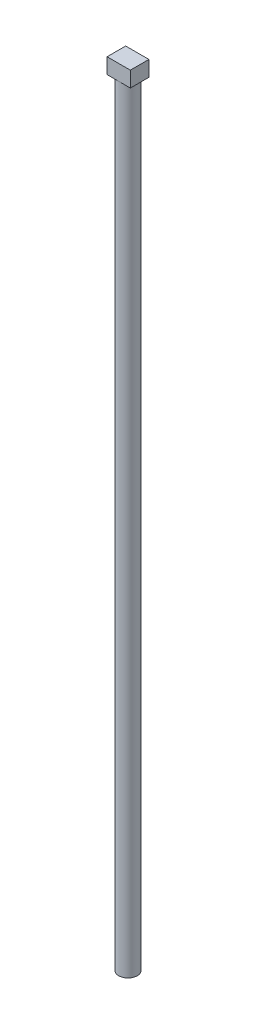
ISO-10303-21;
HEADER;
FILE_DESCRIPTION(('STEP AP214'),'2;1');
FILE_NAME('part.step','',(''),(''),'','','');
FILE_SCHEMA(('AUTOMOTIVE_DESIGN { 1 0 10303 214 1 1 1 1 }'));
ENDSEC;
DATA;
#1=APPLICATION_CONTEXT('core data for automotive mechanical design processes');
#2=APPLICATION_PROTOCOL_DEFINITION('international standard','automotive_design',2000,#1);
#3=PRODUCT_CONTEXT('',#1,'mechanical');
#4=PRODUCT('Part','Part','',(#3));
#5=PRODUCT_RELATED_PRODUCT_CATEGORY('part','',(#4));
#6=PRODUCT_DEFINITION_FORMATION('','',#4);
#7=PRODUCT_DEFINITION_CONTEXT('part definition',#1,'design');
#8=PRODUCT_DEFINITION('design','',#6,#7);
#9=PRODUCT_DEFINITION_SHAPE('','',#8);
#10=(LENGTH_UNIT() NAMED_UNIT(*) SI_UNIT(.MILLI.,.METRE.));
#11=(NAMED_UNIT(*) PLANE_ANGLE_UNIT() SI_UNIT($,.RADIAN.));
#12=(NAMED_UNIT(*) SI_UNIT($,.STERADIAN.) SOLID_ANGLE_UNIT());
#13=UNCERTAINTY_MEASURE_WITH_UNIT(LENGTH_MEASURE(1.E-05),#10,'distance_accuracy_value','');
#14=(GEOMETRIC_REPRESENTATION_CONTEXT(3) GLOBAL_UNCERTAINTY_ASSIGNED_CONTEXT((#13)) GLOBAL_UNIT_ASSIGNED_CONTEXT((#10,
#11,#12)) REPRESENTATION_CONTEXT('',''));
#15=CARTESIAN_POINT('',(0.,0.,0.));
#16=DIRECTION('',(0.,0.,1.));
#17=DIRECTION('',(1.,0.,0.));
#18=AXIS2_PLACEMENT_3D('',#15,#16,#17);
#19=CARTESIAN_POINT('',(0.,0.,0.));
#20=DIRECTION('',(0.,1.,0.));
#21=DIRECTION('',(0.,0.,1.));
#22=AXIS2_PLACEMENT_3D('',#19,#20,#21);
#23=PLANE('',#22);
#24=CARTESIAN_POINT('',(0.,0.,0.));
#25=DIRECTION('',(0.,1.,0.));
#26=DIRECTION('',(0.,0.,1.));
#27=AXIS2_PLACEMENT_3D('',#24,#25,#26);
#28=CIRCLE('',#27,1.2);
#29=CARTESIAN_POINT('',(0.,0.,1.2));
#30=VERTEX_POINT('',#29);
#31=EDGE_CURVE('E44',#30,#30,#28,.T.);
#32=ORIENTED_EDGE('',*,*,#31,.F.);
#33=EDGE_LOOP('',(#32));
#34=FACE_BOUND('',#33,.T.);
#35=CARTESIAN_POINT('',(0.,0.,0.));
#36=DIRECTION('',(0.,1.,0.));
#37=DIRECTION('',(0.,0.,1.));
#38=AXIS2_PLACEMENT_3D('',#35,#36,#37);
#39=CIRCLE('',#38,0.7);
#40=CARTESIAN_POINT('',(0.,0.,0.7));
#41=VERTEX_POINT('',#40);
#42=EDGE_CURVE('E111',#41,#41,#39,.T.);
#43=ORIENTED_EDGE('',*,*,#42,.T.);
#44=EDGE_LOOP('',(#43));
#45=FACE_BOUND('',#44,.T.);
#46=ADVANCED_FACE('F40',(#34,#45),#23,.F.);
#47=CARTESIAN_POINT('',(0.,100.,0.));
#48=DIRECTION('',(0.,-1.,0.));
#49=DIRECTION('',(0.,0.,-1.));
#50=AXIS2_PLACEMENT_3D('',#47,#48,#49);
#51=CYLINDRICAL_SURFACE('',#50,1.2);
#52=CARTESIAN_POINT('',(0.,100.,0.));
#53=DIRECTION('',(0.,1.,0.));
#54=DIRECTION('',(0.,0.,1.));
#55=AXIS2_PLACEMENT_3D('',#52,#53,#54);
#56=CIRCLE('',#55,1.2);
#57=CARTESIAN_POINT('',(0.,100.,1.2));
#58=VERTEX_POINT('',#57);
#59=CARTESIAN_POINT('',(0.,100.,-1.2));
#60=VERTEX_POINT('',#59);
#61=EDGE_CURVE('E11',#58,#60,#56,.T.);
#62=ORIENTED_EDGE('',*,*,#61,.F.);
#63=EDGE_CURVE('E49',#60,#58,#56,.T.);
#64=ORIENTED_EDGE('',*,*,#63,.F.);
#65=EDGE_LOOP('',(#62,#64));
#66=FACE_BOUND('',#65,.T.);
#67=ORIENTED_EDGE('',*,*,#31,.T.);
#68=EDGE_LOOP('',(#67));
#69=FACE_BOUND('',#68,.T.);
#70=ADVANCED_FACE('F42',(#66,#69),#51,.T.);
#71=CARTESIAN_POINT('',(0.,100.,0.));
#72=DIRECTION('',(0.,-1.,0.));
#73=DIRECTION('',(0.,0.,-1.));
#74=AXIS2_PLACEMENT_3D('',#71,#72,#73);
#75=CYLINDRICAL_SURFACE('',#74,0.7);
#76=CARTESIAN_POINT('',(0.,100.,0.));
#77=DIRECTION('',(0.,1.,0.));
#78=DIRECTION('',(0.,0.,1.));
#79=AXIS2_PLACEMENT_3D('',#76,#77,#78);
#80=CIRCLE('',#79,0.7);
#81=CARTESIAN_POINT('',(0.,100.,0.7));
#82=VERTEX_POINT('',#81);
#83=EDGE_CURVE('E108',#82,#82,#80,.T.);
#84=ORIENTED_EDGE('',*,*,#83,.T.);
#85=EDGE_LOOP('',(#84));
#86=FACE_BOUND('',#85,.T.);
#87=ORIENTED_EDGE('',*,*,#42,.F.);
#88=EDGE_LOOP('',(#87));
#89=FACE_BOUND('',#88,.T.);
#90=ADVANCED_FACE('F163',(#86,#89),#75,.F.);
#91=CARTESIAN_POINT('',(0.,100.,0.));
#92=DIRECTION('',(0.,-1.,0.));
#93=DIRECTION('',(0.,0.,-1.));
#94=AXIS2_PLACEMENT_3D('',#91,#92,#93);
#95=PLANE('',#94);
#96=ORIENTED_EDGE('',*,*,#83,.F.);
#97=EDGE_LOOP('',(#96));
#98=FACE_BOUND('',#97,.T.);
#99=ADVANCED_FACE('F167',(#98),#95,.T.);
#100=DIRECTION('',(1.,0.,0.));
#101=VECTOR('',#100,1.);
#102=CARTESIAN_POINT('',(-1.5,100.,1.2));
#103=LINE('',#102,#101);
#104=CARTESIAN_POINT('',(1.5,100.,1.2));
#105=VERTEX_POINT('',#104);
#106=EDGE_CURVE('E132',#58,#105,#103,.T.);
#107=ORIENTED_EDGE('',*,*,#106,.F.);
#108=ORIENTED_EDGE('',*,*,#61,.T.);
#109=DIRECTION('',(-1.,0.,0.));
#110=VECTOR('',#109,1.);
#111=CARTESIAN_POINT('',(-1.5,100.,-1.2));
#112=LINE('',#111,#110);
#113=CARTESIAN_POINT('',(1.5,100.,-1.2));
#114=VERTEX_POINT('',#113);
#115=EDGE_CURVE('E147',#114,#60,#112,.T.);
#116=ORIENTED_EDGE('',*,*,#115,.F.);
#117=DIRECTION('',(0.,0.,-1.));
#118=VECTOR('',#117,1.);
#119=CARTESIAN_POINT('',(1.5,100.,1.2));
#120=LINE('',#119,#118);
#121=EDGE_CURVE('E107',#105,#114,#120,.T.);
#122=ORIENTED_EDGE('',*,*,#121,.F.);
#123=EDGE_LOOP('',(#107,#108,#116,#122));
#124=FACE_BOUND('',#123,.T.);
#125=ADVANCED_FACE('F133',(#124),#95,.T.);
#126=CARTESIAN_POINT('',(1.5,102.,1.2));
#127=DIRECTION('',(-1.,0.,0.));
#128=DIRECTION('',(0.,0.,1.));
#129=AXIS2_PLACEMENT_3D('',#126,#127,#128);
#130=PLANE('',#129);
#131=ORIENTED_EDGE('',*,*,#121,.T.);
#132=DIRECTION('',(0.,-1.,0.));
#133=VECTOR('',#132,1.);
#134=CARTESIAN_POINT('',(1.5,102.,-1.2));
#135=LINE('',#134,#133);
#136=CARTESIAN_POINT('',(1.5,102.,-1.2));
#137=VERTEX_POINT('',#136);
#138=EDGE_CURVE('E87',#137,#114,#135,.T.);
#139=ORIENTED_EDGE('',*,*,#138,.F.);
#140=DIRECTION('',(0.,0.,-1.));
#141=VECTOR('',#140,1.);
#142=CARTESIAN_POINT('',(1.5,102.,1.2));
#143=LINE('',#142,#141);
#144=CARTESIAN_POINT('',(1.5,102.,1.2));
#145=VERTEX_POINT('',#144);
#146=EDGE_CURVE('E94',#145,#137,#143,.T.);
#147=ORIENTED_EDGE('',*,*,#146,.F.);
#148=DIRECTION('',(0.,-1.,0.));
#149=VECTOR('',#148,1.);
#150=CARTESIAN_POINT('',(1.5,102.,1.2));
#151=LINE('',#150,#149);
#152=EDGE_CURVE('E143',#145,#105,#151,.T.);
#153=ORIENTED_EDGE('',*,*,#152,.T.);
#154=EDGE_LOOP('',(#131,#139,#147,#153));
#155=FACE_BOUND('',#154,.T.);
#156=ADVANCED_FACE('F105',(#155),#130,.F.);
#157=CARTESIAN_POINT('',(-1.5,102.,-1.2));
#158=DIRECTION('',(0.,0.,1.));
#159=DIRECTION('',(1.,0.,0.));
#160=AXIS2_PLACEMENT_3D('',#157,#158,#159);
#161=PLANE('',#160);
#162=ORIENTED_EDGE('',*,*,#115,.T.);
#163=CARTESIAN_POINT('',(-1.5,100.,-1.2));
#164=VERTEX_POINT('',#163);
#165=EDGE_CURVE('E130',#60,#164,#112,.T.);
#166=ORIENTED_EDGE('',*,*,#165,.T.);
#167=DIRECTION('',(0.,-1.,0.));
#168=VECTOR('',#167,1.);
#169=CARTESIAN_POINT('',(-1.5,102.,-1.2));
#170=LINE('',#169,#168);
#171=CARTESIAN_POINT('',(-1.5,102.,-1.2));
#172=VERTEX_POINT('',#171);
#173=EDGE_CURVE('E90',#172,#164,#170,.T.);
#174=ORIENTED_EDGE('',*,*,#173,.F.);
#175=DIRECTION('',(-1.,0.,0.));
#176=VECTOR('',#175,1.);
#177=CARTESIAN_POINT('',(-1.5,102.,-1.2));
#178=LINE('',#177,#176);
#179=EDGE_CURVE('E82',#137,#172,#178,.T.);
#180=ORIENTED_EDGE('',*,*,#179,.F.);
#181=ORIENTED_EDGE('',*,*,#138,.T.);
#182=EDGE_LOOP('',(#162,#166,#174,#180,#181));
#183=FACE_BOUND('',#182,.T.);
#184=ADVANCED_FACE('F85',(#183),#161,.F.);
#185=CARTESIAN_POINT('',(-1.5,102.,1.2));
#186=DIRECTION('',(1.,0.,0.));
#187=DIRECTION('',(0.,0.,-1.));
#188=AXIS2_PLACEMENT_3D('',#185,#186,#187);
#189=PLANE('',#188);
#190=DIRECTION('',(0.,0.,1.));
#191=VECTOR('',#190,1.);
#192=CARTESIAN_POINT('',(-1.5,100.,1.2));
#193=LINE('',#192,#191);
#194=CARTESIAN_POINT('',(-1.5,100.,1.2));
#195=VERTEX_POINT('',#194);
#196=EDGE_CURVE('E135',#164,#195,#193,.T.);
#197=ORIENTED_EDGE('',*,*,#196,.T.);
#198=DIRECTION('',(0.,-1.,0.));
#199=VECTOR('',#198,1.);
#200=CARTESIAN_POINT('',(-1.5,102.,1.2));
#201=LINE('',#200,#199);
#202=CARTESIAN_POINT('',(-1.5,102.,1.2));
#203=VERTEX_POINT('',#202);
#204=EDGE_CURVE('E113',#203,#195,#201,.T.);
#205=ORIENTED_EDGE('',*,*,#204,.F.);
#206=DIRECTION('',(0.,0.,1.));
#207=VECTOR('',#206,1.);
#208=CARTESIAN_POINT('',(-1.5,102.,1.2));
#209=LINE('',#208,#207);
#210=EDGE_CURVE('E93',#172,#203,#209,.T.);
#211=ORIENTED_EDGE('',*,*,#210,.F.);
#212=ORIENTED_EDGE('',*,*,#173,.T.);
#213=EDGE_LOOP('',(#197,#205,#211,#212));
#214=FACE_BOUND('',#213,.T.);
#215=ADVANCED_FACE('F149',(#214),#189,.F.);
#216=CARTESIAN_POINT('',(-1.5,102.,1.2));
#217=DIRECTION('',(0.,0.,-1.));
#218=DIRECTION('',(-1.,0.,0.));
#219=AXIS2_PLACEMENT_3D('',#216,#217,#218);
#220=PLANE('',#219);
#221=EDGE_CURVE('E103',#195,#58,#103,.T.);
#222=ORIENTED_EDGE('',*,*,#221,.T.);
#223=ORIENTED_EDGE('',*,*,#106,.T.);
#224=ORIENTED_EDGE('',*,*,#152,.F.);
#225=DIRECTION('',(1.,0.,0.));
#226=VECTOR('',#225,1.);
#227=CARTESIAN_POINT('',(-1.5,102.,1.2));
#228=LINE('',#227,#226);
#229=EDGE_CURVE('E99',#203,#145,#228,.T.);
#230=ORIENTED_EDGE('',*,*,#229,.F.);
#231=ORIENTED_EDGE('',*,*,#204,.T.);
#232=EDGE_LOOP('',(#222,#223,#224,#230,#231));
#233=FACE_BOUND('',#232,.T.);
#234=ADVANCED_FACE('F138',(#233),#220,.F.);
#235=CARTESIAN_POINT('',(0.,102.,0.));
#236=DIRECTION('',(0.,-1.,0.));
#237=DIRECTION('',(0.,0.,-1.));
#238=AXIS2_PLACEMENT_3D('',#235,#236,#237);
#239=PLANE('',#238);
#240=ORIENTED_EDGE('',*,*,#146,.T.);
#241=ORIENTED_EDGE('',*,*,#179,.T.);
#242=ORIENTED_EDGE('',*,*,#210,.T.);
#243=ORIENTED_EDGE('',*,*,#229,.T.);
#244=EDGE_LOOP('',(#240,#241,#242,#243));
#245=FACE_BOUND('',#244,.T.);
#246=ADVANCED_FACE('F97',(#245),#239,.F.);
#247=ORIENTED_EDGE('',*,*,#165,.F.);
#248=ORIENTED_EDGE('',*,*,#63,.T.);
#249=ORIENTED_EDGE('',*,*,#221,.F.);
#250=ORIENTED_EDGE('',*,*,#196,.F.);
#251=EDGE_LOOP('',(#247,#248,#249,#250));
#252=FACE_BOUND('',#251,.T.);
#253=ADVANCED_FACE('F127',(#252),#95,.T.);
#254=CLOSED_SHELL('',(#46,#70,#90,#99,#125,#156,#184,#215,#234,#246,#253));
#255=MANIFOLD_SOLID_BREP('B2',#254);
#256=ADVANCED_BREP_SHAPE_REPRESENTATION('',(#18,#255),#14);
#257=SHAPE_DEFINITION_REPRESENTATION(#9,#256);
ENDSEC;
END-ISO-10303-21;
